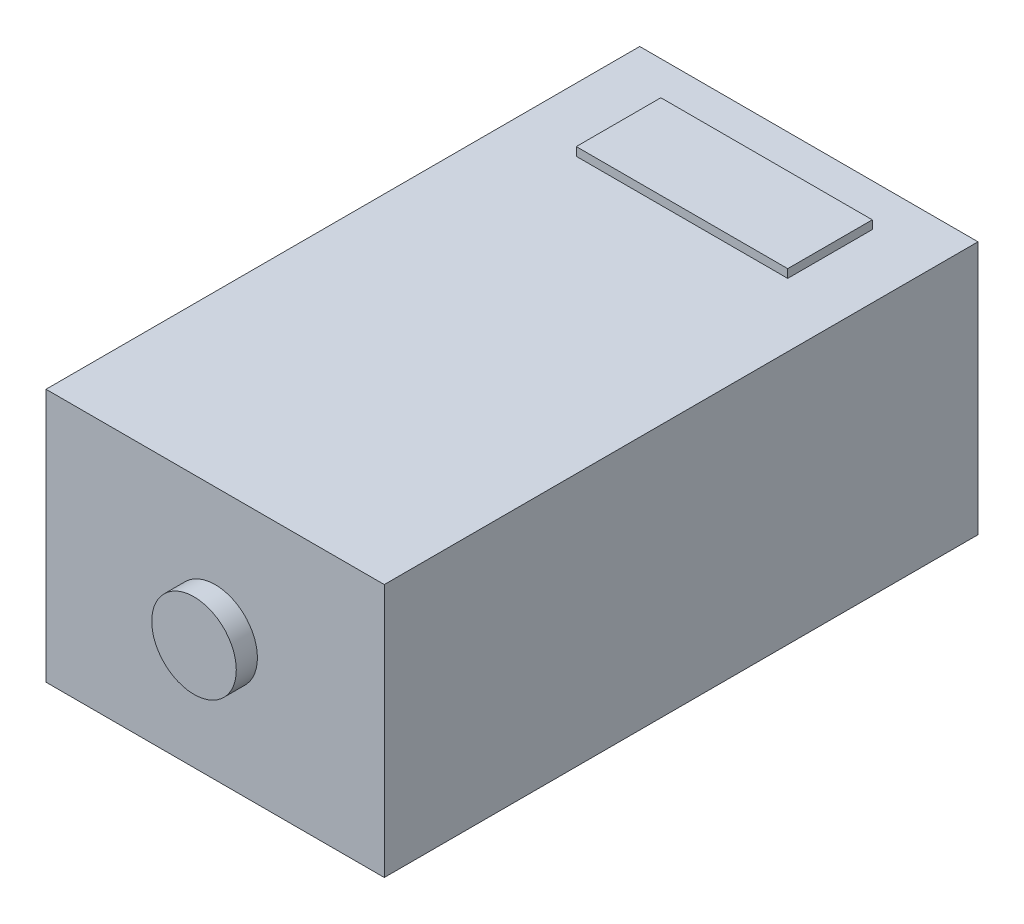
ISO-10303-21;
HEADER;
FILE_DESCRIPTION(('STEP AP214'),'2;1');
FILE_NAME('part.step','',(''),(''),'','','');
FILE_SCHEMA(('AUTOMOTIVE_DESIGN { 1 0 10303 214 1 1 1 1 }'));
ENDSEC;
DATA;
#1=APPLICATION_CONTEXT('core data for automotive mechanical design processes');
#2=APPLICATION_PROTOCOL_DEFINITION('international standard','automotive_design',2000,#1);
#3=PRODUCT_CONTEXT('',#1,'mechanical');
#4=PRODUCT('Part','Part','',(#3));
#5=PRODUCT_RELATED_PRODUCT_CATEGORY('part','',(#4));
#6=PRODUCT_DEFINITION_FORMATION('','',#4);
#7=PRODUCT_DEFINITION_CONTEXT('part definition',#1,'design');
#8=PRODUCT_DEFINITION('design','',#6,#7);
#9=PRODUCT_DEFINITION_SHAPE('','',#8);
#10=(LENGTH_UNIT() NAMED_UNIT(*) SI_UNIT(.MILLI.,.METRE.));
#11=(NAMED_UNIT(*) PLANE_ANGLE_UNIT() SI_UNIT($,.RADIAN.));
#12=(NAMED_UNIT(*) SI_UNIT($,.STERADIAN.) SOLID_ANGLE_UNIT());
#13=UNCERTAINTY_MEASURE_WITH_UNIT(LENGTH_MEASURE(1.E-05),#10,'distance_accuracy_value','');
#14=(GEOMETRIC_REPRESENTATION_CONTEXT(3) GLOBAL_UNCERTAINTY_ASSIGNED_CONTEXT((#13)) GLOBAL_UNIT_ASSIGNED_CONTEXT((#10,
#11,#12)) REPRESENTATION_CONTEXT('',''));
#15=CARTESIAN_POINT('',(0.,0.,0.));
#16=DIRECTION('',(0.,0.,1.));
#17=DIRECTION('',(1.,0.,0.));
#18=AXIS2_PLACEMENT_3D('',#15,#16,#17);
#19=CARTESIAN_POINT('',(0.,300.,702.));
#20=DIRECTION('',(0.,-1.,0.));
#21=DIRECTION('',(0.,0.,-1.));
#22=AXIS2_PLACEMENT_3D('',#19,#20,#21);
#23=PLANE('',#22);
#24=DIRECTION('',(-1.,0.,0.));
#25=VECTOR('',#24,1.);
#26=CARTESIAN_POINT('',(0.,300.,0.));
#27=LINE('',#26,#25);
#28=CARTESIAN_POINT('',(400.,300.,0.));
#29=VERTEX_POINT('',#28);
#30=CARTESIAN_POINT('',(0.,300.,0.));
#31=VERTEX_POINT('',#30);
#32=EDGE_CURVE('E167',#29,#31,#27,.T.);
#33=ORIENTED_EDGE('',*,*,#32,.T.);
#34=DIRECTION('',(0.,0.,-1.));
#35=VECTOR('',#34,1.);
#36=CARTESIAN_POINT('',(0.,300.,702.));
#37=LINE('',#36,#35);
#38=CARTESIAN_POINT('',(0.,300.,702.));
#39=VERTEX_POINT('',#38);
#40=EDGE_CURVE('E173',#39,#31,#37,.T.);
#41=ORIENTED_EDGE('',*,*,#40,.F.);
#42=DIRECTION('',(-1.,0.,0.));
#43=VECTOR('',#42,1.);
#44=CARTESIAN_POINT('',(0.,300.,702.));
#45=LINE('',#44,#43);
#46=CARTESIAN_POINT('',(400.,300.,702.));
#47=VERTEX_POINT('',#46);
#48=EDGE_CURVE('E171',#47,#39,#45,.T.);
#49=ORIENTED_EDGE('',*,*,#48,.F.);
#50=DIRECTION('',(0.,0.,-1.));
#51=VECTOR('',#50,1.);
#52=CARTESIAN_POINT('',(400.,300.,702.));
#53=LINE('',#52,#51);
#54=EDGE_CURVE('E183',#47,#29,#53,.T.);
#55=ORIENTED_EDGE('',*,*,#54,.T.);
#56=EDGE_LOOP('',(#33,#41,#49,#55));
#57=FACE_BOUND('',#56,.T.);
#58=DIRECTION('',(0.,0.,-1.));
#59=VECTOR('',#58,1.);
#60=CARTESIAN_POINT('',(325.,300.,50.));
#61=LINE('',#60,#59);
#62=CARTESIAN_POINT('',(325.,300.,150.));
#63=VERTEX_POINT('',#62);
#64=CARTESIAN_POINT('',(325.,300.,50.));
#65=VERTEX_POINT('',#64);
#66=EDGE_CURVE('E123',#63,#65,#61,.T.);
#67=ORIENTED_EDGE('',*,*,#66,.F.);
#68=DIRECTION('',(1.,0.,0.));
#69=VECTOR('',#68,1.);
#70=CARTESIAN_POINT('',(75.,300.,150.));
#71=LINE('',#70,#69);
#72=CARTESIAN_POINT('',(75.,300.,150.));
#73=VERTEX_POINT('',#72);
#74=EDGE_CURVE('E120',#73,#63,#71,.T.);
#75=ORIENTED_EDGE('',*,*,#74,.F.);
#76=DIRECTION('',(0.,0.,1.));
#77=VECTOR('',#76,1.);
#78=CARTESIAN_POINT('',(75.,300.,50.));
#79=LINE('',#78,#77);
#80=CARTESIAN_POINT('',(75.,300.,50.));
#81=VERTEX_POINT('',#80);
#82=EDGE_CURVE('E58',#81,#73,#79,.T.);
#83=ORIENTED_EDGE('',*,*,#82,.F.);
#84=DIRECTION('',(-1.,0.,0.));
#85=VECTOR('',#84,1.);
#86=CARTESIAN_POINT('',(75.,300.,50.));
#87=LINE('',#86,#85);
#88=EDGE_CURVE('E53',#65,#81,#87,.T.);
#89=ORIENTED_EDGE('',*,*,#88,.F.);
#90=EDGE_LOOP('',(#67,#75,#83,#89));
#91=FACE_BOUND('',#90,.T.);
#92=ADVANCED_FACE('F37',(#57,#91),#23,.F.);
#93=CARTESIAN_POINT('',(0.,0.,702.));
#94=DIRECTION('',(1.,0.,0.));
#95=DIRECTION('',(0.,0.,-1.));
#96=AXIS2_PLACEMENT_3D('',#93,#94,#95);
#97=PLANE('',#96);
#98=DIRECTION('',(0.,-1.,0.));
#99=VECTOR('',#98,1.);
#100=CARTESIAN_POINT('',(0.,0.,0.));
#101=LINE('',#100,#99);
#102=CARTESIAN_POINT('',(0.,0.,0.));
#103=VERTEX_POINT('',#102);
#104=EDGE_CURVE('E160',#31,#103,#101,.T.);
#105=ORIENTED_EDGE('',*,*,#104,.T.);
#106=DIRECTION('',(0.,0.,-1.));
#107=VECTOR('',#106,1.);
#108=CARTESIAN_POINT('',(0.,0.,702.));
#109=LINE('',#108,#107);
#110=CARTESIAN_POINT('',(0.,0.,702.));
#111=VERTEX_POINT('',#110);
#112=EDGE_CURVE('E41',#111,#103,#109,.T.);
#113=ORIENTED_EDGE('',*,*,#112,.F.);
#114=DIRECTION('',(0.,-1.,0.));
#115=VECTOR('',#114,1.);
#116=CARTESIAN_POINT('',(0.,0.,702.));
#117=LINE('',#116,#115);
#118=EDGE_CURVE('E163',#39,#111,#117,.T.);
#119=ORIENTED_EDGE('',*,*,#118,.F.);
#120=ORIENTED_EDGE('',*,*,#40,.T.);
#121=EDGE_LOOP('',(#105,#113,#119,#120));
#122=FACE_BOUND('',#121,.T.);
#123=ADVANCED_FACE('F39',(#122),#97,.F.);
#124=CARTESIAN_POINT('',(0.,0.,702.));
#125=DIRECTION('',(0.,1.,0.));
#126=DIRECTION('',(0.,0.,1.));
#127=AXIS2_PLACEMENT_3D('',#124,#125,#126);
#128=PLANE('',#127);
#129=DIRECTION('',(1.,0.,0.));
#130=VECTOR('',#129,1.);
#131=CARTESIAN_POINT('',(0.,0.,0.));
#132=LINE('',#131,#130);
#133=CARTESIAN_POINT('',(400.,0.,0.));
#134=VERTEX_POINT('',#133);
#135=EDGE_CURVE('E176',#103,#134,#132,.T.);
#136=ORIENTED_EDGE('',*,*,#135,.T.);
#137=DIRECTION('',(0.,0.,-1.));
#138=VECTOR('',#137,1.);
#139=CARTESIAN_POINT('',(400.,0.,702.));
#140=LINE('',#139,#138);
#141=CARTESIAN_POINT('',(400.,0.,702.));
#142=VERTEX_POINT('',#141);
#143=EDGE_CURVE('E185',#142,#134,#140,.T.);
#144=ORIENTED_EDGE('',*,*,#143,.F.);
#145=DIRECTION('',(1.,0.,0.));
#146=VECTOR('',#145,1.);
#147=CARTESIAN_POINT('',(0.,0.,702.));
#148=LINE('',#147,#146);
#149=EDGE_CURVE('E166',#111,#142,#148,.T.);
#150=ORIENTED_EDGE('',*,*,#149,.F.);
#151=ORIENTED_EDGE('',*,*,#112,.T.);
#152=EDGE_LOOP('',(#136,#144,#150,#151));
#153=FACE_BOUND('',#152,.T.);
#154=ADVANCED_FACE('F194',(#153),#128,.F.);
#155=CARTESIAN_POINT('',(400.,0.,702.));
#156=DIRECTION('',(-1.,0.,0.));
#157=DIRECTION('',(0.,0.,1.));
#158=AXIS2_PLACEMENT_3D('',#155,#156,#157);
#159=PLANE('',#158);
#160=DIRECTION('',(0.,1.,0.));
#161=VECTOR('',#160,1.);
#162=CARTESIAN_POINT('',(400.,0.,0.));
#163=LINE('',#162,#161);
#164=EDGE_CURVE('E178',#134,#29,#163,.T.);
#165=ORIENTED_EDGE('',*,*,#164,.T.);
#166=ORIENTED_EDGE('',*,*,#54,.F.);
#167=DIRECTION('',(0.,1.,0.));
#168=VECTOR('',#167,1.);
#169=CARTESIAN_POINT('',(400.,0.,702.));
#170=LINE('',#169,#168);
#171=EDGE_CURVE('E169',#142,#47,#170,.T.);
#172=ORIENTED_EDGE('',*,*,#171,.F.);
#173=ORIENTED_EDGE('',*,*,#143,.T.);
#174=EDGE_LOOP('',(#165,#166,#172,#173));
#175=FACE_BOUND('',#174,.T.);
#176=ADVANCED_FACE('F203',(#175),#159,.F.);
#177=CARTESIAN_POINT('',(0.,0.,702.));
#178=DIRECTION('',(0.,0.,-1.));
#179=DIRECTION('',(-1.,0.,0.));
#180=AXIS2_PLACEMENT_3D('',#177,#178,#179);
#181=PLANE('',#180);
#182=CARTESIAN_POINT('',(200.,150.,702.));
#183=DIRECTION('',(0.,0.,1.));
#184=DIRECTION('',(1.,0.,0.));
#185=AXIS2_PLACEMENT_3D('',#182,#183,#184);
#186=CIRCLE('',#185,50.);
#187=CARTESIAN_POINT('',(250.,150.,702.));
#188=VERTEX_POINT('',#187);
#189=EDGE_CURVE('E11',#188,#188,#186,.T.);
#190=ORIENTED_EDGE('',*,*,#189,.F.);
#191=EDGE_LOOP('',(#190));
#192=FACE_BOUND('',#191,.T.);
#193=ORIENTED_EDGE('',*,*,#118,.T.);
#194=ORIENTED_EDGE('',*,*,#149,.T.);
#195=ORIENTED_EDGE('',*,*,#171,.T.);
#196=ORIENTED_EDGE('',*,*,#48,.T.);
#197=EDGE_LOOP('',(#193,#194,#195,#196));
#198=FACE_BOUND('',#197,.T.);
#199=ADVANCED_FACE('F207',(#192,#198),#181,.F.);
#200=CARTESIAN_POINT('',(0.,0.,0.));
#201=DIRECTION('',(0.,0.,-1.));
#202=DIRECTION('',(-1.,0.,0.));
#203=AXIS2_PLACEMENT_3D('',#200,#201,#202);
#204=PLANE('',#203);
#205=CARTESIAN_POINT('',(68.,60.,0.));
#206=DIRECTION('',(0.,0.,-1.));
#207=DIRECTION('',(-1.,0.,0.));
#208=AXIS2_PLACEMENT_3D('',#205,#206,#207);
#209=CIRCLE('',#208,13.4);
#210=CARTESIAN_POINT('',(54.6,60.,0.));
#211=VERTEX_POINT('',#210);
#212=EDGE_CURVE('E127',#211,#211,#209,.T.);
#213=ORIENTED_EDGE('',*,*,#212,.F.);
#214=EDGE_LOOP('',(#213));
#215=FACE_BOUND('',#214,.T.);
#216=CARTESIAN_POINT('',(133.,30.,0.));
#217=DIRECTION('',(0.,0.,-1.));
#218=DIRECTION('',(-1.,0.,0.));
#219=AXIS2_PLACEMENT_3D('',#216,#217,#218);
#220=CIRCLE('',#219,10.65);
#221=CARTESIAN_POINT('',(122.35,30.,0.));
#222=VERTEX_POINT('',#221);
#223=EDGE_CURVE('E136',#222,#222,#220,.T.);
#224=ORIENTED_EDGE('',*,*,#223,.F.);
#225=EDGE_LOOP('',(#224));
#226=FACE_BOUND('',#225,.T.);
#227=CARTESIAN_POINT('',(165.,200.,0.));
#228=DIRECTION('',(0.,0.,-1.));
#229=DIRECTION('',(-1.,0.,0.));
#230=AXIS2_PLACEMENT_3D('',#227,#228,#229);
#231=CIRCLE('',#230,13.4);
#232=CARTESIAN_POINT('',(151.6,200.,0.));
#233=VERTEX_POINT('',#232);
#234=EDGE_CURVE('E142',#233,#233,#231,.T.);
#235=ORIENTED_EDGE('',*,*,#234,.F.);
#236=EDGE_LOOP('',(#235));
#237=FACE_BOUND('',#236,.T.);
#238=CARTESIAN_POINT('',(267.,30.,0.));
#239=DIRECTION('',(0.,0.,-1.));
#240=DIRECTION('',(-1.,0.,0.));
#241=AXIS2_PLACEMENT_3D('',#238,#239,#240);
#242=CIRCLE('',#241,10.65);
#243=CARTESIAN_POINT('',(256.35,30.,0.));
#244=VERTEX_POINT('',#243);
#245=EDGE_CURVE('E148',#244,#244,#242,.T.);
#246=ORIENTED_EDGE('',*,*,#245,.F.);
#247=EDGE_LOOP('',(#246));
#248=FACE_BOUND('',#247,.T.);
#249=CARTESIAN_POINT('',(332.,60.,0.));
#250=DIRECTION('',(0.,0.,-1.));
#251=DIRECTION('',(-1.,0.,0.));
#252=AXIS2_PLACEMENT_3D('',#249,#250,#251);
#253=CIRCLE('',#252,13.4);
#254=CARTESIAN_POINT('',(318.6,60.,0.));
#255=VERTEX_POINT('',#254);
#256=EDGE_CURVE('E154',#255,#255,#253,.T.);
#257=ORIENTED_EDGE('',*,*,#256,.F.);
#258=EDGE_LOOP('',(#257));
#259=FACE_BOUND('',#258,.T.);
#260=ORIENTED_EDGE('',*,*,#104,.F.);
#261=ORIENTED_EDGE('',*,*,#32,.F.);
#262=ORIENTED_EDGE('',*,*,#164,.F.);
#263=ORIENTED_EDGE('',*,*,#135,.F.);
#264=EDGE_LOOP('',(#260,#261,#262,#263));
#265=FACE_BOUND('',#264,.T.);
#266=ADVANCED_FACE('F201',(#215,#226,#237,#248,#259,#265),#204,.T.);
#267=CARTESIAN_POINT('',(332.,60.,-25.));
#268=DIRECTION('',(0.,0.,1.));
#269=DIRECTION('',(1.,0.,0.));
#270=AXIS2_PLACEMENT_3D('',#267,#268,#269);
#271=CYLINDRICAL_SURFACE('',#270,13.4);
#272=CARTESIAN_POINT('',(332.,60.,-25.));
#273=DIRECTION('',(0.,0.,-1.));
#274=DIRECTION('',(-1.,0.,0.));
#275=AXIS2_PLACEMENT_3D('',#272,#273,#274);
#276=CIRCLE('',#275,13.4);
#277=CARTESIAN_POINT('',(318.6,60.,-25.));
#278=VERTEX_POINT('',#277);
#279=EDGE_CURVE('E157',#278,#278,#276,.T.);
#280=ORIENTED_EDGE('',*,*,#279,.F.);
#281=EDGE_LOOP('',(#280));
#282=FACE_BOUND('',#281,.T.);
#283=ORIENTED_EDGE('',*,*,#256,.T.);
#284=EDGE_LOOP('',(#283));
#285=FACE_BOUND('',#284,.T.);
#286=ADVANCED_FACE('F215',(#282,#285),#271,.T.);
#287=CARTESIAN_POINT('',(332.,60.,-25.));
#288=DIRECTION('',(0.,0.,-1.));
#289=DIRECTION('',(-1.,0.,0.));
#290=AXIS2_PLACEMENT_3D('',#287,#288,#289);
#291=PLANE('',#290);
#292=ORIENTED_EDGE('',*,*,#279,.T.);
#293=EDGE_LOOP('',(#292));
#294=FACE_BOUND('',#293,.T.);
#295=ADVANCED_FACE('F251',(#294),#291,.T.);
#296=CARTESIAN_POINT('',(267.,30.,-25.));
#297=DIRECTION('',(0.,0.,1.));
#298=DIRECTION('',(1.,0.,0.));
#299=AXIS2_PLACEMENT_3D('',#296,#297,#298);
#300=CYLINDRICAL_SURFACE('',#299,10.65);
#301=CARTESIAN_POINT('',(267.,30.,-25.));
#302=DIRECTION('',(0.,0.,-1.));
#303=DIRECTION('',(-1.,0.,0.));
#304=AXIS2_PLACEMENT_3D('',#301,#302,#303);
#305=CIRCLE('',#304,10.65);
#306=CARTESIAN_POINT('',(256.35,30.,-25.));
#307=VERTEX_POINT('',#306);
#308=EDGE_CURVE('E151',#307,#307,#305,.T.);
#309=ORIENTED_EDGE('',*,*,#308,.F.);
#310=EDGE_LOOP('',(#309));
#311=FACE_BOUND('',#310,.T.);
#312=ORIENTED_EDGE('',*,*,#245,.T.);
#313=EDGE_LOOP('',(#312));
#314=FACE_BOUND('',#313,.T.);
#315=ADVANCED_FACE('F260',(#311,#314),#300,.T.);
#316=CARTESIAN_POINT('',(267.,30.,-25.));
#317=DIRECTION('',(0.,0.,-1.));
#318=DIRECTION('',(-1.,0.,0.));
#319=AXIS2_PLACEMENT_3D('',#316,#317,#318);
#320=PLANE('',#319);
#321=ORIENTED_EDGE('',*,*,#308,.T.);
#322=EDGE_LOOP('',(#321));
#323=FACE_BOUND('',#322,.T.);
#324=ADVANCED_FACE('F270',(#323),#320,.T.);
#325=CARTESIAN_POINT('',(165.,200.,-25.));
#326=DIRECTION('',(0.,0.,1.));
#327=DIRECTION('',(1.,0.,0.));
#328=AXIS2_PLACEMENT_3D('',#325,#326,#327);
#329=CYLINDRICAL_SURFACE('',#328,13.4);
#330=CARTESIAN_POINT('',(165.,200.,-25.));
#331=DIRECTION('',(0.,0.,-1.));
#332=DIRECTION('',(-1.,0.,0.));
#333=AXIS2_PLACEMENT_3D('',#330,#331,#332);
#334=CIRCLE('',#333,13.4);
#335=CARTESIAN_POINT('',(151.6,200.,-25.));
#336=VERTEX_POINT('',#335);
#337=EDGE_CURVE('E145',#336,#336,#334,.T.);
#338=ORIENTED_EDGE('',*,*,#337,.F.);
#339=EDGE_LOOP('',(#338));
#340=FACE_BOUND('',#339,.T.);
#341=ORIENTED_EDGE('',*,*,#234,.T.);
#342=EDGE_LOOP('',(#341));
#343=FACE_BOUND('',#342,.T.);
#344=ADVANCED_FACE('F280',(#340,#343),#329,.T.);
#345=CARTESIAN_POINT('',(165.,200.,-25.));
#346=DIRECTION('',(0.,0.,-1.));
#347=DIRECTION('',(-1.,0.,0.));
#348=AXIS2_PLACEMENT_3D('',#345,#346,#347);
#349=PLANE('',#348);
#350=ORIENTED_EDGE('',*,*,#337,.T.);
#351=EDGE_LOOP('',(#350));
#352=FACE_BOUND('',#351,.T.);
#353=ADVANCED_FACE('F290',(#352),#349,.T.);
#354=CARTESIAN_POINT('',(133.,30.,-25.));
#355=DIRECTION('',(0.,0.,1.));
#356=DIRECTION('',(1.,0.,0.));
#357=AXIS2_PLACEMENT_3D('',#354,#355,#356);
#358=CYLINDRICAL_SURFACE('',#357,10.65);
#359=CARTESIAN_POINT('',(133.,30.,-25.));
#360=DIRECTION('',(0.,0.,-1.));
#361=DIRECTION('',(-1.,0.,0.));
#362=AXIS2_PLACEMENT_3D('',#359,#360,#361);
#363=CIRCLE('',#362,10.65);
#364=CARTESIAN_POINT('',(122.35,30.,-25.));
#365=VERTEX_POINT('',#364);
#366=EDGE_CURVE('E139',#365,#365,#363,.T.);
#367=ORIENTED_EDGE('',*,*,#366,.F.);
#368=EDGE_LOOP('',(#367));
#369=FACE_BOUND('',#368,.T.);
#370=ORIENTED_EDGE('',*,*,#223,.T.);
#371=EDGE_LOOP('',(#370));
#372=FACE_BOUND('',#371,.T.);
#373=ADVANCED_FACE('F300',(#369,#372),#358,.T.);
#374=CARTESIAN_POINT('',(133.,30.,-25.));
#375=DIRECTION('',(0.,0.,-1.));
#376=DIRECTION('',(-1.,0.,0.));
#377=AXIS2_PLACEMENT_3D('',#374,#375,#376);
#378=PLANE('',#377);
#379=ORIENTED_EDGE('',*,*,#366,.T.);
#380=EDGE_LOOP('',(#379));
#381=FACE_BOUND('',#380,.T.);
#382=ADVANCED_FACE('F310',(#381),#378,.T.);
#383=CARTESIAN_POINT('',(68.,60.,-25.));
#384=DIRECTION('',(0.,0.,1.));
#385=DIRECTION('',(1.,0.,0.));
#386=AXIS2_PLACEMENT_3D('',#383,#384,#385);
#387=CYLINDRICAL_SURFACE('',#386,13.4);
#388=CARTESIAN_POINT('',(68.,60.,-25.));
#389=DIRECTION('',(0.,0.,-1.));
#390=DIRECTION('',(-1.,0.,0.));
#391=AXIS2_PLACEMENT_3D('',#388,#389,#390);
#392=CIRCLE('',#391,13.4);
#393=CARTESIAN_POINT('',(54.6,60.,-25.));
#394=VERTEX_POINT('',#393);
#395=EDGE_CURVE('E133',#394,#394,#392,.T.);
#396=ORIENTED_EDGE('',*,*,#395,.F.);
#397=EDGE_LOOP('',(#396));
#398=FACE_BOUND('',#397,.T.);
#399=ORIENTED_EDGE('',*,*,#212,.T.);
#400=EDGE_LOOP('',(#399));
#401=FACE_BOUND('',#400,.T.);
#402=ADVANCED_FACE('F320',(#398,#401),#387,.T.);
#403=CARTESIAN_POINT('',(68.,60.,-25.));
#404=DIRECTION('',(0.,0.,-1.));
#405=DIRECTION('',(-1.,0.,0.));
#406=AXIS2_PLACEMENT_3D('',#403,#404,#405);
#407=PLANE('',#406);
#408=ORIENTED_EDGE('',*,*,#395,.T.);
#409=EDGE_LOOP('',(#408));
#410=FACE_BOUND('',#409,.T.);
#411=ADVANCED_FACE('F330',(#410),#407,.T.);
#412=CARTESIAN_POINT('',(200.,150.,727.));
#413=DIRECTION('',(0.,0.,-1.));
#414=DIRECTION('',(-1.,0.,0.));
#415=AXIS2_PLACEMENT_3D('',#412,#413,#414);
#416=CYLINDRICAL_SURFACE('',#415,50.);
#417=CARTESIAN_POINT('',(200.,150.,727.));
#418=DIRECTION('',(0.,0.,1.));
#419=DIRECTION('',(1.,0.,0.));
#420=AXIS2_PLACEMENT_3D('',#417,#418,#419);
#421=CIRCLE('',#420,50.);
#422=CARTESIAN_POINT('',(250.,150.,727.));
#423=VERTEX_POINT('',#422);
#424=EDGE_CURVE('E124',#423,#423,#421,.T.);
#425=ORIENTED_EDGE('',*,*,#424,.F.);
#426=EDGE_LOOP('',(#425));
#427=FACE_BOUND('',#426,.T.);
#428=ORIENTED_EDGE('',*,*,#189,.T.);
#429=EDGE_LOOP('',(#428));
#430=FACE_BOUND('',#429,.T.);
#431=ADVANCED_FACE('F339',(#427,#430),#416,.T.);
#432=CARTESIAN_POINT('',(200.,150.,727.));
#433=DIRECTION('',(0.,0.,1.));
#434=DIRECTION('',(1.,0.,0.));
#435=AXIS2_PLACEMENT_3D('',#432,#433,#434);
#436=PLANE('',#435);
#437=ORIENTED_EDGE('',*,*,#424,.T.);
#438=EDGE_LOOP('',(#437));
#439=FACE_BOUND('',#438,.T.);
#440=ADVANCED_FACE('F353',(#439),#436,.T.);
#441=CARTESIAN_POINT('',(325.,310.,50.));
#442=DIRECTION('',(-1.,0.,0.));
#443=DIRECTION('',(0.,0.,1.));
#444=AXIS2_PLACEMENT_3D('',#441,#442,#443);
#445=PLANE('',#444);
#446=ORIENTED_EDGE('',*,*,#66,.T.);
#447=DIRECTION('',(0.,-1.,0.));
#448=VECTOR('',#447,1.);
#449=CARTESIAN_POINT('',(325.,310.,50.));
#450=LINE('',#449,#448);
#451=CARTESIAN_POINT('',(325.,310.,50.));
#452=VERTEX_POINT('',#451);
#453=EDGE_CURVE('E104',#452,#65,#450,.T.);
#454=ORIENTED_EDGE('',*,*,#453,.F.);
#455=DIRECTION('',(0.,0.,-1.));
#456=VECTOR('',#455,1.);
#457=CARTESIAN_POINT('',(325.,310.,50.));
#458=LINE('',#457,#456);
#459=CARTESIAN_POINT('',(325.,310.,150.));
#460=VERTEX_POINT('',#459);
#461=EDGE_CURVE('E111',#460,#452,#458,.T.);
#462=ORIENTED_EDGE('',*,*,#461,.F.);
#463=DIRECTION('',(0.,-1.,0.));
#464=VECTOR('',#463,1.);
#465=CARTESIAN_POINT('',(325.,310.,150.));
#466=LINE('',#465,#464);
#467=EDGE_CURVE('E419',#460,#63,#466,.T.);
#468=ORIENTED_EDGE('',*,*,#467,.T.);
#469=EDGE_LOOP('',(#446,#454,#462,#468));
#470=FACE_BOUND('',#469,.T.);
#471=ADVANCED_FACE('F122',(#470),#445,.F.);
#472=CARTESIAN_POINT('',(75.,310.,50.));
#473=DIRECTION('',(0.,0.,1.));
#474=DIRECTION('',(1.,0.,0.));
#475=AXIS2_PLACEMENT_3D('',#472,#473,#474);
#476=PLANE('',#475);
#477=ORIENTED_EDGE('',*,*,#88,.T.);
#478=DIRECTION('',(0.,-1.,0.));
#479=VECTOR('',#478,1.);
#480=CARTESIAN_POINT('',(75.,310.,50.));
#481=LINE('',#480,#479);
#482=CARTESIAN_POINT('',(75.,310.,50.));
#483=VERTEX_POINT('',#482);
#484=EDGE_CURVE('E107',#483,#81,#481,.T.);
#485=ORIENTED_EDGE('',*,*,#484,.F.);
#486=DIRECTION('',(-1.,0.,0.));
#487=VECTOR('',#486,1.);
#488=CARTESIAN_POINT('',(75.,310.,50.));
#489=LINE('',#488,#487);
#490=EDGE_CURVE('E100',#452,#483,#489,.T.);
#491=ORIENTED_EDGE('',*,*,#490,.F.);
#492=ORIENTED_EDGE('',*,*,#453,.T.);
#493=EDGE_LOOP('',(#477,#485,#491,#492));
#494=FACE_BOUND('',#493,.T.);
#495=ADVANCED_FACE('F102',(#494),#476,.F.);
#496=CARTESIAN_POINT('',(75.,310.,50.));
#497=DIRECTION('',(1.,0.,0.));
#498=DIRECTION('',(0.,0.,-1.));
#499=AXIS2_PLACEMENT_3D('',#496,#497,#498);
#500=PLANE('',#499);
#501=ORIENTED_EDGE('',*,*,#82,.T.);
#502=DIRECTION('',(0.,-1.,0.));
#503=VECTOR('',#502,1.);
#504=CARTESIAN_POINT('',(75.,310.,150.));
#505=LINE('',#504,#503);
#506=CARTESIAN_POINT('',(75.,310.,150.));
#507=VERTEX_POINT('',#506);
#508=EDGE_CURVE('E129',#507,#73,#505,.T.);
#509=ORIENTED_EDGE('',*,*,#508,.F.);
#510=DIRECTION('',(0.,0.,1.));
#511=VECTOR('',#510,1.);
#512=CARTESIAN_POINT('',(75.,310.,50.));
#513=LINE('',#512,#511);
#514=EDGE_CURVE('E110',#483,#507,#513,.T.);
#515=ORIENTED_EDGE('',*,*,#514,.F.);
#516=ORIENTED_EDGE('',*,*,#484,.T.);
#517=EDGE_LOOP('',(#501,#509,#515,#516));
#518=FACE_BOUND('',#517,.T.);
#519=ADVANCED_FACE('F384',(#518),#500,.F.);
#520=CARTESIAN_POINT('',(75.,310.,150.));
#521=DIRECTION('',(0.,0.,-1.));
#522=DIRECTION('',(-1.,0.,0.));
#523=AXIS2_PLACEMENT_3D('',#520,#521,#522);
#524=PLANE('',#523);
#525=ORIENTED_EDGE('',*,*,#74,.T.);
#526=ORIENTED_EDGE('',*,*,#467,.F.);
#527=DIRECTION('',(1.,0.,0.));
#528=VECTOR('',#527,1.);
#529=CARTESIAN_POINT('',(75.,310.,150.));
#530=LINE('',#529,#528);
#531=EDGE_CURVE('E116',#507,#460,#530,.T.);
#532=ORIENTED_EDGE('',*,*,#531,.F.);
#533=ORIENTED_EDGE('',*,*,#508,.T.);
#534=EDGE_LOOP('',(#525,#526,#532,#533));
#535=FACE_BOUND('',#534,.T.);
#536=ADVANCED_FACE('F393',(#535),#524,.F.);
#537=CARTESIAN_POINT('',(0.,310.,0.));
#538=DIRECTION('',(0.,1.,0.));
#539=DIRECTION('',(0.,0.,1.));
#540=AXIS2_PLACEMENT_3D('',#537,#538,#539);
#541=PLANE('',#540);
#542=ORIENTED_EDGE('',*,*,#461,.T.);
#543=ORIENTED_EDGE('',*,*,#490,.T.);
#544=ORIENTED_EDGE('',*,*,#514,.T.);
#545=ORIENTED_EDGE('',*,*,#531,.T.);
#546=EDGE_LOOP('',(#542,#543,#544,#545));
#547=FACE_BOUND('',#546,.T.);
#548=ADVANCED_FACE('F114',(#547),#541,.T.);
#549=CLOSED_SHELL('',(#92,#123,#154,#176,#199,#266,#286,#295,#315,#324,#344,#353,#373,#382,#402,
#411,#431,#440,#471,#495,#519,#536,#548));
#550=MANIFOLD_SOLID_BREP('B2',#549);
#551=ADVANCED_BREP_SHAPE_REPRESENTATION('',(#18,#550),#14);
#552=SHAPE_DEFINITION_REPRESENTATION(#9,#551);
ENDSEC;
END-ISO-10303-21;
